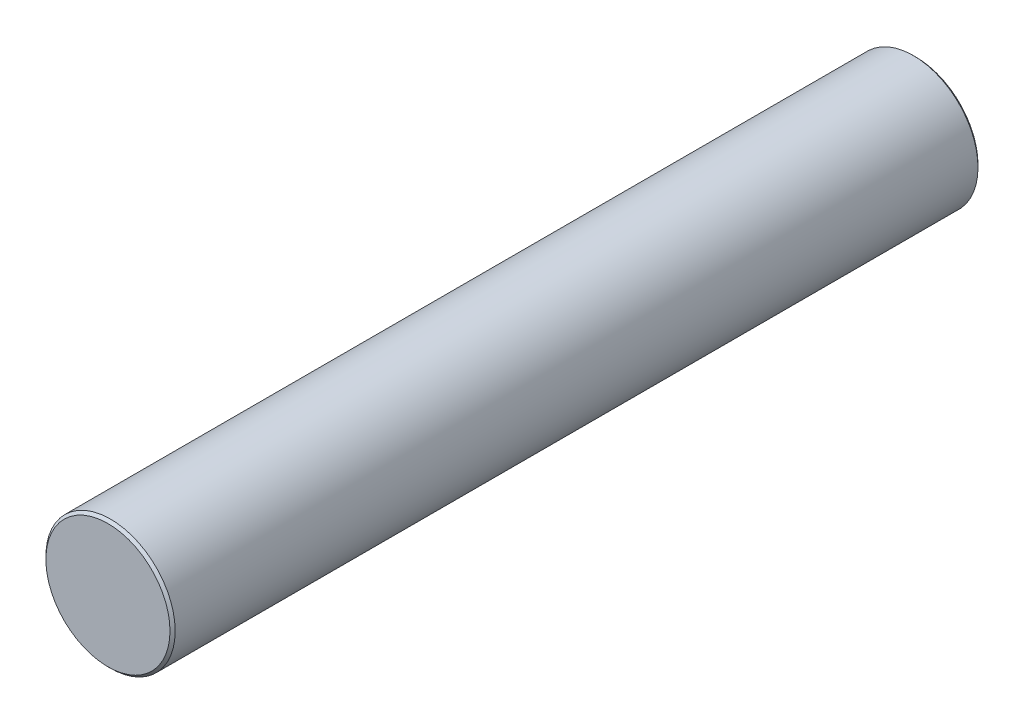
ISO-10303-21;
HEADER;
FILE_DESCRIPTION(('STEP AP214'),'2;1');
FILE_NAME('part.step','',(''),(''),'','','');
FILE_SCHEMA(('AUTOMOTIVE_DESIGN { 1 0 10303 214 1 1 1 1 }'));
ENDSEC;
DATA;
#1=APPLICATION_CONTEXT('core data for automotive mechanical design processes');
#2=APPLICATION_PROTOCOL_DEFINITION('international standard','automotive_design',2000,#1);
#3=PRODUCT_CONTEXT('',#1,'mechanical');
#4=PRODUCT('Part','Part','',(#3));
#5=PRODUCT_RELATED_PRODUCT_CATEGORY('part','',(#4));
#6=PRODUCT_DEFINITION_FORMATION('','',#4);
#7=PRODUCT_DEFINITION_CONTEXT('part definition',#1,'design');
#8=PRODUCT_DEFINITION('design','',#6,#7);
#9=PRODUCT_DEFINITION_SHAPE('','',#8);
#10=(LENGTH_UNIT() NAMED_UNIT(*) SI_UNIT(.MILLI.,.METRE.));
#11=(NAMED_UNIT(*) PLANE_ANGLE_UNIT() SI_UNIT($,.RADIAN.));
#12=(NAMED_UNIT(*) SI_UNIT($,.STERADIAN.) SOLID_ANGLE_UNIT());
#13=UNCERTAINTY_MEASURE_WITH_UNIT(LENGTH_MEASURE(1.E-05),#10,'distance_accuracy_value','');
#14=(GEOMETRIC_REPRESENTATION_CONTEXT(3) GLOBAL_UNCERTAINTY_ASSIGNED_CONTEXT((#13)) GLOBAL_UNIT_ASSIGNED_CONTEXT((#10,
#11,#12)) REPRESENTATION_CONTEXT('',''));
#15=CARTESIAN_POINT('',(0.,0.,0.));
#16=DIRECTION('',(0.,0.,1.));
#17=DIRECTION('',(1.,0.,0.));
#18=AXIS2_PLACEMENT_3D('',#15,#16,#17);
#19=CARTESIAN_POINT('',(0.,0.,25.));
#20=DIRECTION('',(0.,0.,-1.));
#21=DIRECTION('',(-1.,0.,0.));
#22=AXIS2_PLACEMENT_3D('',#19,#20,#21);
#23=CYLINDRICAL_SURFACE('',#22,4.);
#24=CARTESIAN_POINT('',(0.,0.,-24.84));
#25=DIRECTION('',(0.,0.,1.));
#26=DIRECTION('',(1.,0.,0.));
#27=AXIS2_PLACEMENT_3D('',#24,#25,#26);
#28=CIRCLE('',#27,4.);
#29=CARTESIAN_POINT('',(4.,0.,-24.84));
#30=VERTEX_POINT('',#29);
#31=EDGE_CURVE('E41',#30,#30,#28,.T.);
#32=ORIENTED_EDGE('',*,*,#31,.T.);
#33=EDGE_LOOP('',(#32));
#34=FACE_BOUND('',#33,.T.);
#35=CARTESIAN_POINT('',(0.,0.,24.84));
#36=DIRECTION('',(0.,0.,1.));
#37=DIRECTION('',(1.,0.,0.));
#38=AXIS2_PLACEMENT_3D('',#35,#36,#37);
#39=CIRCLE('',#38,4.);
#40=CARTESIAN_POINT('',(4.,0.,24.84));
#41=VERTEX_POINT('',#40);
#42=EDGE_CURVE('E45',#41,#41,#39,.F.);
#43=ORIENTED_EDGE('',*,*,#42,.T.);
#44=EDGE_LOOP('',(#43));
#45=FACE_BOUND('',#44,.T.);
#46=ADVANCED_FACE('F30',(#34,#45),#23,.T.);
#47=CARTESIAN_POINT('',(0.,0.,25.));
#48=DIRECTION('',(0.,0.,1.));
#49=DIRECTION('',(1.,0.,0.));
#50=AXIS2_PLACEMENT_3D('',#47,#48,#49);
#51=PLANE('',#50);
#52=CARTESIAN_POINT('',(0.,0.,25.));
#53=DIRECTION('',(0.,0.,1.));
#54=DIRECTION('',(1.,0.,0.));
#55=AXIS2_PLACEMENT_3D('',#52,#53,#54);
#56=CIRCLE('',#55,3.84);
#57=CARTESIAN_POINT('',(3.84,0.,25.));
#58=VERTEX_POINT('',#57);
#59=EDGE_CURVE('E10',#58,#58,#56,.T.);
#60=ORIENTED_EDGE('',*,*,#59,.T.);
#61=EDGE_LOOP('',(#60));
#62=FACE_BOUND('',#61,.T.);
#63=ADVANCED_FACE('F61',(#62),#51,.T.);
#64=CARTESIAN_POINT('',(0.,0.,-25.));
#65=DIRECTION('',(0.,0.,1.));
#66=DIRECTION('',(1.,0.,0.));
#67=AXIS2_PLACEMENT_3D('',#64,#65,#66);
#68=PLANE('',#67);
#69=CARTESIAN_POINT('',(0.,0.,-25.));
#70=DIRECTION('',(0.,0.,1.));
#71=DIRECTION('',(1.,0.,0.));
#72=AXIS2_PLACEMENT_3D('',#69,#70,#71);
#73=CIRCLE('',#72,3.84000000000001);
#74=CARTESIAN_POINT('',(3.84000000000001,0.,-25.));
#75=VERTEX_POINT('',#74);
#76=EDGE_CURVE('E37',#75,#75,#73,.F.);
#77=ORIENTED_EDGE('',*,*,#76,.T.);
#78=EDGE_LOOP('',(#77));
#79=FACE_BOUND('',#78,.T.);
#80=ADVANCED_FACE('F58',(#79),#68,.F.);
#81=CARTESIAN_POINT('',(0.,0.,-24.84));
#82=DIRECTION('',(0.,0.,1.));
#83=DIRECTION('',(1.,0.,0.));
#84=AXIS2_PLACEMENT_3D('',#81,#82,#83);
#85=CONICAL_SURFACE('',#84,4.,0.785398163397437);
#86=ORIENTED_EDGE('',*,*,#76,.F.);
#87=EDGE_LOOP('',(#86));
#88=FACE_BOUND('',#87,.T.);
#89=ORIENTED_EDGE('',*,*,#31,.F.);
#90=EDGE_LOOP('',(#89));
#91=FACE_BOUND('',#90,.T.);
#92=ADVANCED_FACE('F54',(#88,#91),#85,.T.);
#93=CARTESIAN_POINT('',(0.,0.,25.));
#94=DIRECTION('',(0.,0.,-1.));
#95=DIRECTION('',(-1.,0.,0.));
#96=AXIS2_PLACEMENT_3D('',#93,#94,#95);
#97=CONICAL_SURFACE('',#96,3.84,0.785398163397459);
#98=ORIENTED_EDGE('',*,*,#42,.F.);
#99=EDGE_LOOP('',(#98));
#100=FACE_BOUND('',#99,.T.);
#101=ORIENTED_EDGE('',*,*,#59,.F.);
#102=EDGE_LOOP('',(#101));
#103=FACE_BOUND('',#102,.T.);
#104=ADVANCED_FACE('F32',(#100,#103),#97,.T.);
#105=CLOSED_SHELL('',(#46,#63,#80,#92,#104));
#106=MANIFOLD_SOLID_BREP('B2',#105);
#107=ADVANCED_BREP_SHAPE_REPRESENTATION('',(#18,#106),#14);
#108=SHAPE_DEFINITION_REPRESENTATION(#9,#107);
ENDSEC;
END-ISO-10303-21;
